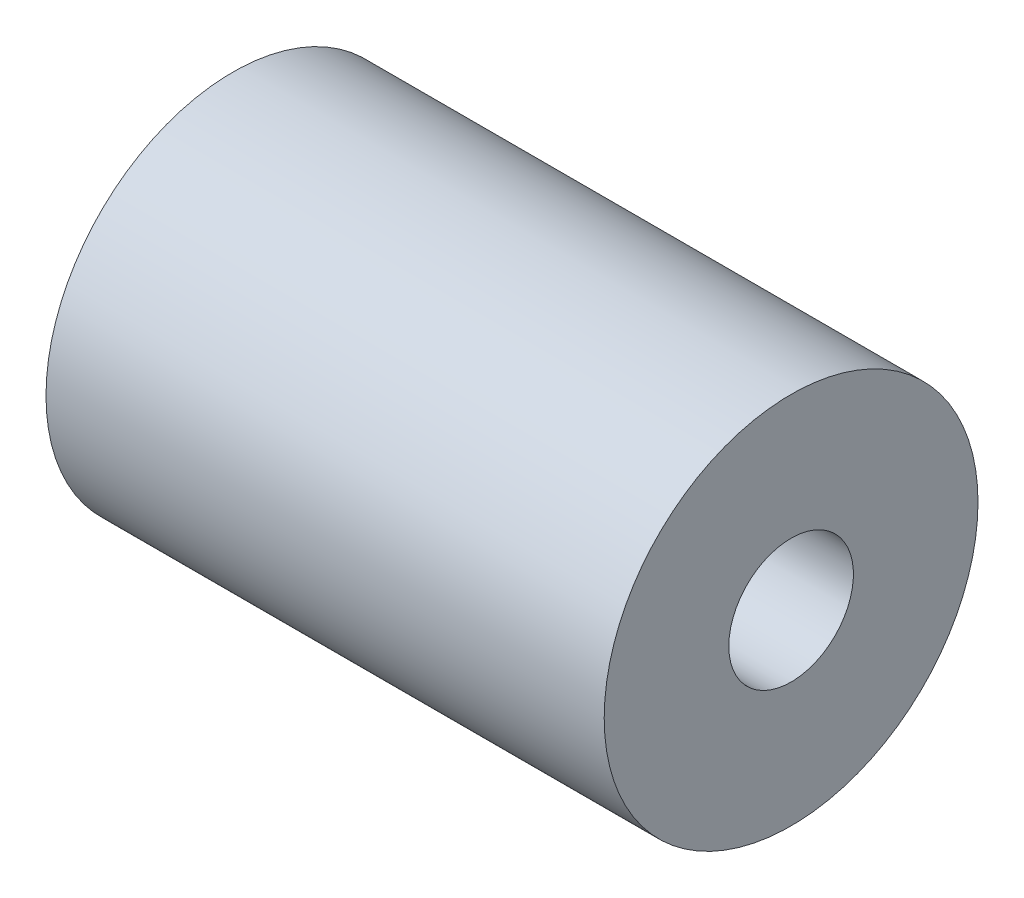
ISO-10303-21;
HEADER;
FILE_DESCRIPTION(('STEP AP214'),'2;1');
FILE_NAME('part.step','',(''),(''),'','','');
FILE_SCHEMA(('AUTOMOTIVE_DESIGN { 1 0 10303 214 1 1 1 1 }'));
ENDSEC;
DATA;
#1=APPLICATION_CONTEXT('core data for automotive mechanical design processes');
#2=APPLICATION_PROTOCOL_DEFINITION('international standard','automotive_design',2000,#1);
#3=PRODUCT_CONTEXT('',#1,'mechanical');
#4=PRODUCT('Part','Part','',(#3));
#5=PRODUCT_RELATED_PRODUCT_CATEGORY('part','',(#4));
#6=PRODUCT_DEFINITION_FORMATION('','',#4);
#7=PRODUCT_DEFINITION_CONTEXT('part definition',#1,'design');
#8=PRODUCT_DEFINITION('design','',#6,#7);
#9=PRODUCT_DEFINITION_SHAPE('','',#8);
#10=(LENGTH_UNIT() NAMED_UNIT(*) SI_UNIT(.MILLI.,.METRE.));
#11=(NAMED_UNIT(*) PLANE_ANGLE_UNIT() SI_UNIT($,.RADIAN.));
#12=(NAMED_UNIT(*) SI_UNIT($,.STERADIAN.) SOLID_ANGLE_UNIT());
#13=UNCERTAINTY_MEASURE_WITH_UNIT(LENGTH_MEASURE(1.E-05),#10,'distance_accuracy_value','');
#14=(GEOMETRIC_REPRESENTATION_CONTEXT(3) GLOBAL_UNCERTAINTY_ASSIGNED_CONTEXT((#13)) GLOBAL_UNIT_ASSIGNED_CONTEXT((#10,
#11,#12)) REPRESENTATION_CONTEXT('',''));
#15=CARTESIAN_POINT('',(0.,0.,0.));
#16=DIRECTION('',(0.,0.,1.));
#17=DIRECTION('',(1.,0.,0.));
#18=AXIS2_PLACEMENT_3D('',#15,#16,#17);
#19=CARTESIAN_POINT('',(28.448,0.,0.));
#20=DIRECTION('',(1.,0.,0.));
#21=DIRECTION('',(0.,0.,1.));
#22=AXIS2_PLACEMENT_3D('',#19,#20,#21);
#23=PLANE('',#22);
#24=CARTESIAN_POINT('',(28.448,0.,0.));
#25=DIRECTION('',(-1.,0.,0.));
#26=DIRECTION('',(0.,0.,1.));
#27=AXIS2_PLACEMENT_3D('',#24,#25,#26);
#28=CIRCLE('',#27,9.525);
#29=CARTESIAN_POINT('',(28.448,0.,9.525));
#30=VERTEX_POINT('',#29);
#31=EDGE_CURVE('E10',#30,#30,#28,.T.);
#32=ORIENTED_EDGE('',*,*,#31,.F.);
#33=EDGE_LOOP('',(#32));
#34=FACE_BOUND('',#33,.T.);
#35=CARTESIAN_POINT('',(28.448,0.,0.));
#36=DIRECTION('',(-1.,0.,0.));
#37=DIRECTION('',(0.,0.,1.));
#38=AXIS2_PLACEMENT_3D('',#35,#36,#37);
#39=CIRCLE('',#38,3.175);
#40=CARTESIAN_POINT('',(28.448,0.,3.175));
#41=VERTEX_POINT('',#40);
#42=EDGE_CURVE('E46',#41,#41,#39,.T.);
#43=ORIENTED_EDGE('',*,*,#42,.T.);
#44=EDGE_LOOP('',(#43));
#45=FACE_BOUND('',#44,.T.);
#46=ADVANCED_FACE('F35',(#34,#45),#23,.T.);
#47=CARTESIAN_POINT('',(0.,0.,0.));
#48=DIRECTION('',(1.,0.,0.));
#49=DIRECTION('',(0.,0.,1.));
#50=AXIS2_PLACEMENT_3D('',#47,#48,#49);
#51=PLANE('',#50);
#52=CARTESIAN_POINT('',(0.,0.,0.));
#53=DIRECTION('',(-1.,0.,0.));
#54=DIRECTION('',(0.,0.,1.));
#55=AXIS2_PLACEMENT_3D('',#52,#53,#54);
#56=CIRCLE('',#55,9.525);
#57=CARTESIAN_POINT('',(0.,0.,9.525));
#58=VERTEX_POINT('',#57);
#59=EDGE_CURVE('E39',#58,#58,#56,.T.);
#60=ORIENTED_EDGE('',*,*,#59,.T.);
#61=EDGE_LOOP('',(#60));
#62=FACE_BOUND('',#61,.T.);
#63=CARTESIAN_POINT('',(0.,0.,0.));
#64=DIRECTION('',(-1.,0.,0.));
#65=DIRECTION('',(0.,0.,1.));
#66=AXIS2_PLACEMENT_3D('',#63,#64,#65);
#67=CIRCLE('',#66,3.175);
#68=CARTESIAN_POINT('',(0.,0.,3.175));
#69=VERTEX_POINT('',#68);
#70=EDGE_CURVE('E48',#69,#69,#67,.T.);
#71=ORIENTED_EDGE('',*,*,#70,.F.);
#72=EDGE_LOOP('',(#71));
#73=FACE_BOUND('',#72,.T.);
#74=ADVANCED_FACE('F61',(#62,#73),#51,.F.);
#75=CARTESIAN_POINT('',(28.448,0.,0.));
#76=DIRECTION('',(-1.,0.,0.));
#77=DIRECTION('',(0.,0.,-1.));
#78=AXIS2_PLACEMENT_3D('',#75,#76,#77);
#79=CYLINDRICAL_SURFACE('',#78,9.525);
#80=ORIENTED_EDGE('',*,*,#31,.T.);
#81=EDGE_LOOP('',(#80));
#82=FACE_BOUND('',#81,.T.);
#83=ORIENTED_EDGE('',*,*,#59,.F.);
#84=EDGE_LOOP('',(#83));
#85=FACE_BOUND('',#84,.T.);
#86=ADVANCED_FACE('F37',(#82,#85),#79,.T.);
#87=CARTESIAN_POINT('',(28.448,0.,0.));
#88=DIRECTION('',(-1.,0.,0.));
#89=DIRECTION('',(0.,0.,-1.));
#90=AXIS2_PLACEMENT_3D('',#87,#88,#89);
#91=CYLINDRICAL_SURFACE('',#90,3.175);
#92=ORIENTED_EDGE('',*,*,#42,.F.);
#93=EDGE_LOOP('',(#92));
#94=FACE_BOUND('',#93,.T.);
#95=ORIENTED_EDGE('',*,*,#70,.T.);
#96=EDGE_LOOP('',(#95));
#97=FACE_BOUND('',#96,.T.);
#98=ADVANCED_FACE('F55',(#94,#97),#91,.F.);
#99=CLOSED_SHELL('',(#46,#74,#86,#98));
#100=MANIFOLD_SOLID_BREP('B2',#99);
#101=ADVANCED_BREP_SHAPE_REPRESENTATION('',(#18,#100),#14);
#102=SHAPE_DEFINITION_REPRESENTATION(#9,#101);
ENDSEC;
END-ISO-10303-21;
